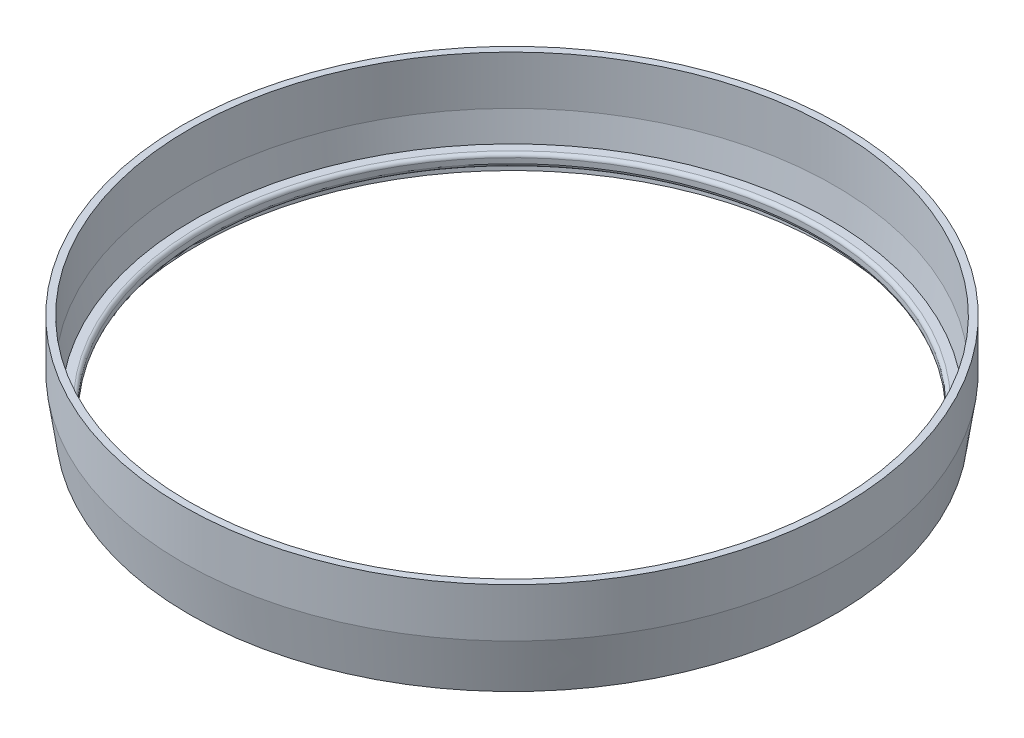
ISO-10303-21;
HEADER;
FILE_DESCRIPTION(('STEP AP214'),'2;1');
FILE_NAME('part.step','',(''),(''),'','','');
FILE_SCHEMA(('AUTOMOTIVE_DESIGN { 1 0 10303 214 1 1 1 1 }'));
ENDSEC;
DATA;
#1=APPLICATION_CONTEXT('core data for automotive mechanical design processes');
#2=APPLICATION_PROTOCOL_DEFINITION('international standard','automotive_design',2000,#1);
#3=PRODUCT_CONTEXT('',#1,'mechanical');
#4=PRODUCT('Part','Part','',(#3));
#5=PRODUCT_RELATED_PRODUCT_CATEGORY('part','',(#4));
#6=PRODUCT_DEFINITION_FORMATION('','',#4);
#7=PRODUCT_DEFINITION_CONTEXT('part definition',#1,'design');
#8=PRODUCT_DEFINITION('design','',#6,#7);
#9=PRODUCT_DEFINITION_SHAPE('','',#8);
#10=(LENGTH_UNIT() NAMED_UNIT(*) SI_UNIT(.MILLI.,.METRE.));
#11=(NAMED_UNIT(*) PLANE_ANGLE_UNIT() SI_UNIT($,.RADIAN.));
#12=(NAMED_UNIT(*) SI_UNIT($,.STERADIAN.) SOLID_ANGLE_UNIT());
#13=UNCERTAINTY_MEASURE_WITH_UNIT(LENGTH_MEASURE(1.E-05),#10,'distance_accuracy_value','');
#14=(GEOMETRIC_REPRESENTATION_CONTEXT(3) GLOBAL_UNCERTAINTY_ASSIGNED_CONTEXT((#13)) GLOBAL_UNIT_ASSIGNED_CONTEXT((#10,
#11,#12)) REPRESENTATION_CONTEXT('',''));
#15=CARTESIAN_POINT('',(0.,0.,0.));
#16=DIRECTION('',(0.,0.,1.));
#17=DIRECTION('',(1.,0.,0.));
#18=AXIS2_PLACEMENT_3D('',#15,#16,#17);
#19=CARTESIAN_POINT('',(46.2788104381215,0.,0.));
#20=DIRECTION('',(0.,1.,0.));
#21=DIRECTION('',(0.,0.,1.));
#22=AXIS2_PLACEMENT_3D('',#19,#20,#21);
#23=PLANE('',#22);
#24=CARTESIAN_POINT('',(0.,0.,0.));
#25=DIRECTION('',(0.,1.,0.));
#26=DIRECTION('',(0.,0.,1.));
#27=AXIS2_PLACEMENT_3D('',#24,#25,#26);
#28=CIRCLE('',#27,46.2788104381215);
#29=CARTESIAN_POINT('',(0.,0.,46.2788104381215));
#30=VERTEX_POINT('',#29);
#31=EDGE_CURVE('E88',#30,#30,#28,.T.);
#32=ORIENTED_EDGE('',*,*,#31,.F.);
#33=EDGE_LOOP('',(#32));
#34=FACE_BOUND('',#33,.T.);
#35=CARTESIAN_POINT('',(0.,0.,0.));
#36=DIRECTION('',(0.,1.,0.));
#37=DIRECTION('',(0.,0.,1.));
#38=AXIS2_PLACEMENT_3D('',#35,#36,#37);
#39=CIRCLE('',#38,45.2788104381215);
#40=CARTESIAN_POINT('',(0.,0.,45.2788104381215));
#41=VERTEX_POINT('',#40);
#42=EDGE_CURVE('E60',#41,#41,#39,.T.);
#43=ORIENTED_EDGE('',*,*,#42,.T.);
#44=EDGE_LOOP('',(#43));
#45=FACE_BOUND('',#44,.T.);
#46=ADVANCED_FACE('F36',(#34,#45),#23,.F.);
#47=CARTESIAN_POINT('',(0.,1.25,0.));
#48=DIRECTION('',(0.,1.,0.));
#49=DIRECTION('',(0.,0.,1.));
#50=AXIS2_PLACEMENT_3D('',#47,#48,#49);
#51=CONICAL_SURFACE('',#50,45.4611657170284,0.144862327915528);
#52=ORIENTED_EDGE('',*,*,#42,.F.);
#53=EDGE_LOOP('',(#52));
#54=FACE_BOUND('',#53,.T.);
#55=CARTESIAN_POINT('',(0.,1.25,0.));
#56=DIRECTION('',(0.,1.,0.));
#57=DIRECTION('',(0.,0.,1.));
#58=AXIS2_PLACEMENT_3D('',#55,#56,#57);
#59=CIRCLE('',#58,45.4611657170284);
#60=CARTESIAN_POINT('',(0.,1.25,45.4611657170284));
#61=VERTEX_POINT('',#60);
#62=EDGE_CURVE('E64',#61,#61,#59,.T.);
#63=ORIENTED_EDGE('',*,*,#62,.T.);
#64=EDGE_LOOP('',(#63));
#65=FACE_BOUND('',#64,.T.);
#66=ADVANCED_FACE('F97',(#54,#65),#51,.F.);
#67=CARTESIAN_POINT('',(45.4611657170284,1.25,0.));
#68=DIRECTION('',(0.,1.,0.));
#69=DIRECTION('',(0.,0.,1.));
#70=AXIS2_PLACEMENT_3D('',#67,#68,#69);
#71=PLANE('',#70);
#72=CARTESIAN_POINT('',(0.,1.25,0.));
#73=DIRECTION('',(0.,1.,0.));
#74=DIRECTION('',(0.,0.,1.));
#75=AXIS2_PLACEMENT_3D('',#72,#73,#74);
#76=CIRCLE('',#75,44.5);
#77=CARTESIAN_POINT('',(0.,1.25,44.5));
#78=VERTEX_POINT('',#77);
#79=EDGE_CURVE('E54',#78,#78,#76,.T.);
#80=ORIENTED_EDGE('',*,*,#79,.T.);
#81=EDGE_LOOP('',(#80));
#82=FACE_BOUND('',#81,.T.);
#83=ORIENTED_EDGE('',*,*,#62,.F.);
#84=EDGE_LOOP('',(#83));
#85=FACE_BOUND('',#84,.T.);
#86=ADVANCED_FACE('F103',(#82,#85),#71,.F.);
#87=CARTESIAN_POINT('',(0.,55.,0.));
#88=DIRECTION('',(0.,1.,0.));
#89=DIRECTION('',(0.,0.,1.));
#90=AXIS2_PLACEMENT_3D('',#87,#88,#89);
#91=CYLINDRICAL_SURFACE('',#90,44.);
#92=CARTESIAN_POINT('',(0.,1.75,0.));
#93=DIRECTION('',(0.,1.,0.));
#94=DIRECTION('',(0.,0.,1.));
#95=AXIS2_PLACEMENT_3D('',#92,#93,#94);
#96=CIRCLE('',#95,44.);
#97=CARTESIAN_POINT('',(0.,1.75,44.));
#98=VERTEX_POINT('',#97);
#99=EDGE_CURVE('E44',#98,#98,#96,.F.);
#100=ORIENTED_EDGE('',*,*,#99,.T.);
#101=EDGE_LOOP('',(#100));
#102=FACE_BOUND('',#101,.T.);
#103=CARTESIAN_POINT('',(0.,2.5,0.));
#104=DIRECTION('',(0.,-1.,0.));
#105=DIRECTION('',(0.,0.,-1.));
#106=AXIS2_PLACEMENT_3D('',#103,#104,#105);
#107=CIRCLE('',#106,44.);
#108=CARTESIAN_POINT('',(0.,2.5,-44.));
#109=VERTEX_POINT('',#108);
#110=EDGE_CURVE('E49',#109,#109,#107,.F.);
#111=ORIENTED_EDGE('',*,*,#110,.T.);
#112=EDGE_LOOP('',(#111));
#113=FACE_BOUND('',#112,.T.);
#114=ADVANCED_FACE('F108',(#102,#113),#91,.F.);
#115=CARTESIAN_POINT('',(44.,3.,0.));
#116=DIRECTION('',(0.,-1.,0.));
#117=DIRECTION('',(0.,0.,-1.));
#118=AXIS2_PLACEMENT_3D('',#115,#116,#117);
#119=PLANE('',#118);
#120=CARTESIAN_POINT('',(0.,3.,0.));
#121=DIRECTION('',(0.,-1.,0.));
#122=DIRECTION('',(0.,0.,-1.));
#123=AXIS2_PLACEMENT_3D('',#120,#121,#122);
#124=CIRCLE('',#123,44.5);
#125=CARTESIAN_POINT('',(0.,3.,-44.5));
#126=VERTEX_POINT('',#125);
#127=EDGE_CURVE('E10',#126,#126,#124,.T.);
#128=ORIENTED_EDGE('',*,*,#127,.T.);
#129=EDGE_LOOP('',(#128));
#130=FACE_BOUND('',#129,.T.);
#131=CARTESIAN_POINT('',(0.,3.,0.));
#132=DIRECTION('',(0.,1.,0.));
#133=DIRECTION('',(0.,0.,1.));
#134=AXIS2_PLACEMENT_3D('',#131,#132,#133);
#135=CIRCLE('',#134,45.716463107498);
#136=CARTESIAN_POINT('',(0.,3.,45.716463107498));
#137=VERTEX_POINT('',#136);
#138=EDGE_CURVE('E68',#137,#137,#135,.T.);
#139=ORIENTED_EDGE('',*,*,#138,.T.);
#140=EDGE_LOOP('',(#139));
#141=FACE_BOUND('',#140,.T.);
#142=ADVANCED_FACE('F114',(#130,#141),#119,.F.);
#143=CARTESIAN_POINT('',(0.,7.,0.));
#144=DIRECTION('',(0.,1.,0.));
#145=DIRECTION('',(0.,0.,1.));
#146=AXIS2_PLACEMENT_3D('',#143,#144,#145);
#147=CONICAL_SURFACE('',#146,46.3,0.144862327915525);
#148=ORIENTED_EDGE('',*,*,#138,.F.);
#149=EDGE_LOOP('',(#148));
#150=FACE_BOUND('',#149,.T.);
#151=CARTESIAN_POINT('',(0.,7.,0.));
#152=DIRECTION('',(0.,1.,0.));
#153=DIRECTION('',(0.,0.,1.));
#154=AXIS2_PLACEMENT_3D('',#151,#152,#153);
#155=CIRCLE('',#154,46.3);
#156=CARTESIAN_POINT('',(0.,7.,46.3));
#157=VERTEX_POINT('',#156);
#158=EDGE_CURVE('E72',#157,#157,#155,.T.);
#159=ORIENTED_EDGE('',*,*,#158,.T.);
#160=EDGE_LOOP('',(#159));
#161=FACE_BOUND('',#160,.T.);
#162=ADVANCED_FACE('F144',(#150,#161),#147,.F.);
#163=CARTESIAN_POINT('',(0.,55.,0.));
#164=DIRECTION('',(0.,1.,0.));
#165=DIRECTION('',(0.,0.,1.));
#166=AXIS2_PLACEMENT_3D('',#163,#164,#165);
#167=CYLINDRICAL_SURFACE('',#166,46.3);
#168=ORIENTED_EDGE('',*,*,#158,.F.);
#169=EDGE_LOOP('',(#168));
#170=FACE_BOUND('',#169,.T.);
#171=CARTESIAN_POINT('',(0.,14.,0.));
#172=DIRECTION('',(0.,1.,0.));
#173=DIRECTION('',(0.,0.,1.));
#174=AXIS2_PLACEMENT_3D('',#171,#172,#173);
#175=CIRCLE('',#174,46.3);
#176=CARTESIAN_POINT('',(0.,14.,46.3));
#177=VERTEX_POINT('',#176);
#178=EDGE_CURVE('E76',#177,#177,#175,.T.);
#179=ORIENTED_EDGE('',*,*,#178,.T.);
#180=EDGE_LOOP('',(#179));
#181=FACE_BOUND('',#180,.T.);
#182=ADVANCED_FACE('F140',(#170,#181),#167,.F.);
#183=CARTESIAN_POINT('',(46.3,14.,0.));
#184=DIRECTION('',(0.,-1.,0.));
#185=DIRECTION('',(0.,0.,-1.));
#186=AXIS2_PLACEMENT_3D('',#183,#184,#185);
#187=PLANE('',#186);
#188=ORIENTED_EDGE('',*,*,#178,.F.);
#189=EDGE_LOOP('',(#188));
#190=FACE_BOUND('',#189,.T.);
#191=CARTESIAN_POINT('',(0.,14.,0.));
#192=DIRECTION('',(0.,1.,0.));
#193=DIRECTION('',(0.,0.,1.));
#194=AXIS2_PLACEMENT_3D('',#191,#192,#193);
#195=CIRCLE('',#194,47.3);
#196=CARTESIAN_POINT('',(0.,14.,47.3));
#197=VERTEX_POINT('',#196);
#198=EDGE_CURVE('E80',#197,#197,#195,.T.);
#199=ORIENTED_EDGE('',*,*,#198,.T.);
#200=EDGE_LOOP('',(#199));
#201=FACE_BOUND('',#200,.T.);
#202=ADVANCED_FACE('F133',(#190,#201),#187,.F.);
#203=CARTESIAN_POINT('',(0.,55.,0.));
#204=DIRECTION('',(0.,1.,0.));
#205=DIRECTION('',(0.,0.,1.));
#206=AXIS2_PLACEMENT_3D('',#203,#204,#205);
#207=CYLINDRICAL_SURFACE('',#206,47.3);
#208=ORIENTED_EDGE('',*,*,#198,.F.);
#209=EDGE_LOOP('',(#208));
#210=FACE_BOUND('',#209,.T.);
#211=CARTESIAN_POINT('',(0.,7.,0.));
#212=DIRECTION('',(0.,1.,0.));
#213=DIRECTION('',(0.,0.,1.));
#214=AXIS2_PLACEMENT_3D('',#211,#212,#213);
#215=CIRCLE('',#214,47.3);
#216=CARTESIAN_POINT('',(0.,7.,47.3));
#217=VERTEX_POINT('',#216);
#218=EDGE_CURVE('E84',#217,#217,#215,.T.);
#219=ORIENTED_EDGE('',*,*,#218,.T.);
#220=EDGE_LOOP('',(#219));
#221=FACE_BOUND('',#220,.T.);
#222=ADVANCED_FACE('F125',(#210,#221),#207,.T.);
#223=CARTESIAN_POINT('',(0.,0.,0.));
#224=DIRECTION('',(0.,1.,0.));
#225=DIRECTION('',(0.,0.,1.));
#226=AXIS2_PLACEMENT_3D('',#223,#224,#225);
#227=CONICAL_SURFACE('',#226,46.2788104381215,0.144862327915525);
#228=ORIENTED_EDGE('',*,*,#218,.F.);
#229=EDGE_LOOP('',(#228));
#230=FACE_BOUND('',#229,.T.);
#231=ORIENTED_EDGE('',*,*,#31,.T.);
#232=EDGE_LOOP('',(#231));
#233=FACE_BOUND('',#232,.T.);
#234=ADVANCED_FACE('F93',(#230,#233),#227,.T.);
#235=CARTESIAN_POINT('',(0.,1.75,0.));
#236=DIRECTION('',(0.,1.,0.));
#237=DIRECTION('',(0.,0.,1.));
#238=AXIS2_PLACEMENT_3D('',#235,#236,#237);
#239=TOROIDAL_SURFACE('',#238,44.5,0.5);
#240=ORIENTED_EDGE('',*,*,#99,.F.);
#241=EDGE_LOOP('',(#240));
#242=FACE_BOUND('',#241,.T.);
#243=ORIENTED_EDGE('',*,*,#79,.F.);
#244=EDGE_LOOP('',(#243));
#245=FACE_BOUND('',#244,.T.);
#246=ADVANCED_FACE('F117',(#242,#245),#239,.T.);
#247=CARTESIAN_POINT('',(0.,2.5,0.));
#248=DIRECTION('',(0.,-1.,0.));
#249=DIRECTION('',(0.,0.,-1.));
#250=AXIS2_PLACEMENT_3D('',#247,#248,#249);
#251=TOROIDAL_SURFACE('',#250,44.5,0.5);
#252=ORIENTED_EDGE('',*,*,#127,.F.);
#253=EDGE_LOOP('',(#252));
#254=FACE_BOUND('',#253,.T.);
#255=ORIENTED_EDGE('',*,*,#110,.F.);
#256=EDGE_LOOP('',(#255));
#257=FACE_BOUND('',#256,.T.);
#258=ADVANCED_FACE('F38',(#254,#257),#251,.T.);
#259=CLOSED_SHELL('',(#46,#66,#86,#114,#142,#162,#182,#202,#222,#234,#246,#258));
#260=MANIFOLD_SOLID_BREP('B2',#259);
#261=ADVANCED_BREP_SHAPE_REPRESENTATION('',(#18,#260),#14);
#262=SHAPE_DEFINITION_REPRESENTATION(#9,#261);
ENDSEC;
END-ISO-10303-21;
